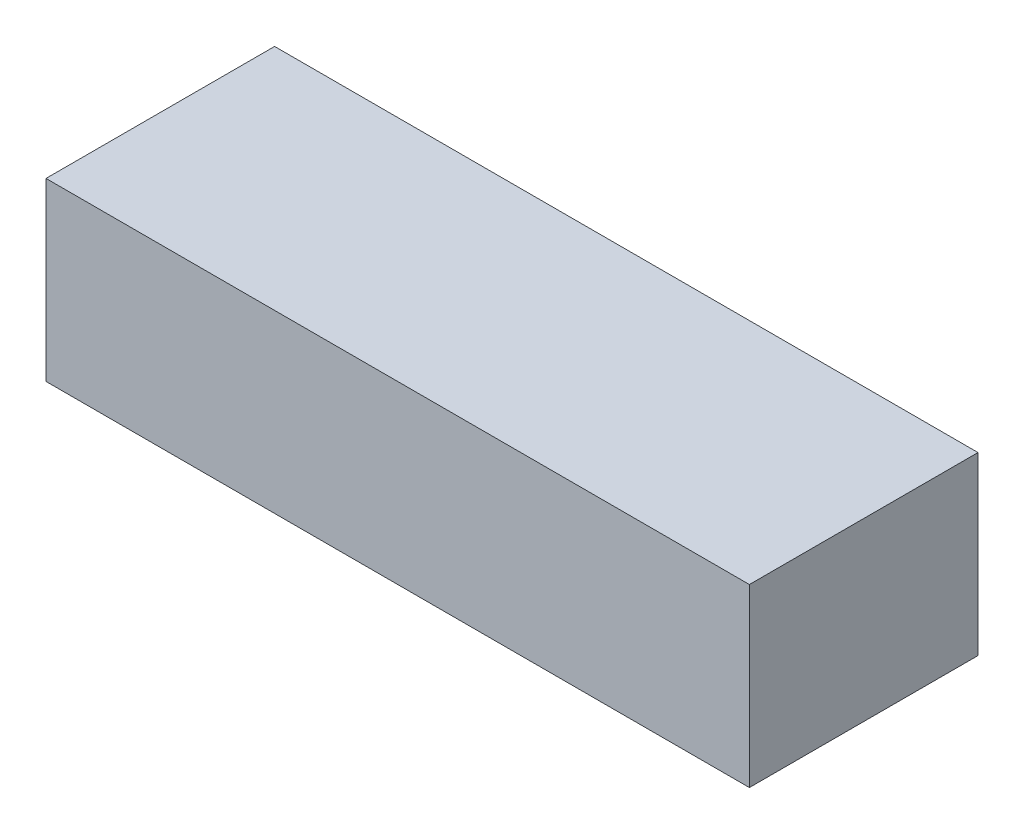
ISO-10303-21;
HEADER;
FILE_DESCRIPTION(('STEP AP214'),'2;1');
FILE_NAME('part.step','',(''),(''),'','','');
FILE_SCHEMA(('AUTOMOTIVE_DESIGN { 1 0 10303 214 1 1 1 1 }'));
ENDSEC;
DATA;
#1=APPLICATION_CONTEXT('core data for automotive mechanical design processes');
#2=APPLICATION_PROTOCOL_DEFINITION('international standard','automotive_design',2000,#1);
#3=PRODUCT_CONTEXT('',#1,'mechanical');
#4=PRODUCT('Part','Part','',(#3));
#5=PRODUCT_RELATED_PRODUCT_CATEGORY('part','',(#4));
#6=PRODUCT_DEFINITION_FORMATION('','',#4);
#7=PRODUCT_DEFINITION_CONTEXT('part definition',#1,'design');
#8=PRODUCT_DEFINITION('design','',#6,#7);
#9=PRODUCT_DEFINITION_SHAPE('','',#8);
#10=(LENGTH_UNIT() NAMED_UNIT(*) SI_UNIT(.MILLI.,.METRE.));
#11=(NAMED_UNIT(*) PLANE_ANGLE_UNIT() SI_UNIT($,.RADIAN.));
#12=(NAMED_UNIT(*) SI_UNIT($,.STERADIAN.) SOLID_ANGLE_UNIT());
#13=UNCERTAINTY_MEASURE_WITH_UNIT(LENGTH_MEASURE(1.E-05),#10,'distance_accuracy_value','');
#14=(GEOMETRIC_REPRESENTATION_CONTEXT(3) GLOBAL_UNCERTAINTY_ASSIGNED_CONTEXT((#13)) GLOBAL_UNIT_ASSIGNED_CONTEXT((#10,
#11,#12)) REPRESENTATION_CONTEXT('',''));
#15=CARTESIAN_POINT('',(0.,0.,0.));
#16=DIRECTION('',(0.,0.,1.));
#17=DIRECTION('',(1.,0.,0.));
#18=AXIS2_PLACEMENT_3D('',#15,#16,#17);
#19=CARTESIAN_POINT('',(0.,-10.,0.));
#20=DIRECTION('',(-1.,0.,0.));
#21=DIRECTION('',(0.,0.,1.));
#22=AXIS2_PLACEMENT_3D('',#19,#20,#21);
#23=PLANE('',#22);
#24=DIRECTION('',(0.,0.,1.));
#25=VECTOR('',#24,1.);
#26=CARTESIAN_POINT('',(0.,0.,0.));
#27=LINE('',#26,#25);
#28=CARTESIAN_POINT('',(0.,0.,-13.));
#29=VERTEX_POINT('',#28);
#30=CARTESIAN_POINT('',(0.,0.,0.));
#31=VERTEX_POINT('',#30);
#32=EDGE_CURVE('E104',#29,#31,#27,.T.);
#33=ORIENTED_EDGE('',*,*,#32,.F.);
#34=DIRECTION('',(0.,1.,0.));
#35=VECTOR('',#34,1.);
#36=CARTESIAN_POINT('',(0.,-10.,-13.));
#37=LINE('',#36,#35);
#38=CARTESIAN_POINT('',(0.,-10.,-13.));
#39=VERTEX_POINT('',#38);
#40=EDGE_CURVE('E11',#39,#29,#37,.T.);
#41=ORIENTED_EDGE('',*,*,#40,.F.);
#42=DIRECTION('',(0.,0.,1.));
#43=VECTOR('',#42,1.);
#44=CARTESIAN_POINT('',(0.,-10.,0.));
#45=LINE('',#44,#43);
#46=CARTESIAN_POINT('',(0.,-10.,0.));
#47=VERTEX_POINT('',#46);
#48=EDGE_CURVE('E100',#39,#47,#45,.T.);
#49=ORIENTED_EDGE('',*,*,#48,.T.);
#50=DIRECTION('',(0.,1.,0.));
#51=VECTOR('',#50,1.);
#52=CARTESIAN_POINT('',(0.,-10.,0.));
#53=LINE('',#52,#51);
#54=EDGE_CURVE('E45',#47,#31,#53,.T.);
#55=ORIENTED_EDGE('',*,*,#54,.T.);
#56=EDGE_LOOP('',(#33,#41,#49,#55));
#57=FACE_BOUND('',#56,.T.);
#58=ADVANCED_FACE('F39',(#57),#23,.T.);
#59=CARTESIAN_POINT('',(0.,-10.,-13.));
#60=DIRECTION('',(0.,0.,-1.));
#61=DIRECTION('',(-1.,0.,0.));
#62=AXIS2_PLACEMENT_3D('',#59,#60,#61);
#63=PLANE('',#62);
#64=DIRECTION('',(-1.,0.,0.));
#65=VECTOR('',#64,1.);
#66=CARTESIAN_POINT('',(0.,0.,-13.));
#67=LINE('',#66,#65);
#68=CARTESIAN_POINT('',(40.,0.,-13.));
#69=VERTEX_POINT('',#68);
#70=EDGE_CURVE('E98',#69,#29,#67,.T.);
#71=ORIENTED_EDGE('',*,*,#70,.F.);
#72=DIRECTION('',(0.,1.,0.));
#73=VECTOR('',#72,1.);
#74=CARTESIAN_POINT('',(40.,-10.,-13.));
#75=LINE('',#74,#73);
#76=CARTESIAN_POINT('',(40.,-10.,-13.));
#77=VERTEX_POINT('',#76);
#78=EDGE_CURVE('E48',#77,#69,#75,.T.);
#79=ORIENTED_EDGE('',*,*,#78,.F.);
#80=DIRECTION('',(-1.,0.,0.));
#81=VECTOR('',#80,1.);
#82=CARTESIAN_POINT('',(0.,-10.,-13.));
#83=LINE('',#82,#81);
#84=EDGE_CURVE('E92',#77,#39,#83,.T.);
#85=ORIENTED_EDGE('',*,*,#84,.T.);
#86=ORIENTED_EDGE('',*,*,#40,.T.);
#87=EDGE_LOOP('',(#71,#79,#85,#86));
#88=FACE_BOUND('',#87,.T.);
#89=ADVANCED_FACE('F111',(#88),#63,.T.);
#90=CARTESIAN_POINT('',(40.,-10.,0.));
#91=DIRECTION('',(1.,0.,0.));
#92=DIRECTION('',(0.,0.,-1.));
#93=AXIS2_PLACEMENT_3D('',#90,#91,#92);
#94=PLANE('',#93);
#95=DIRECTION('',(0.,0.,-1.));
#96=VECTOR('',#95,1.);
#97=CARTESIAN_POINT('',(40.,0.,0.));
#98=LINE('',#97,#96);
#99=CARTESIAN_POINT('',(40.,0.,0.));
#100=VERTEX_POINT('',#99);
#101=EDGE_CURVE('E87',#100,#69,#98,.T.);
#102=ORIENTED_EDGE('',*,*,#101,.F.);
#103=DIRECTION('',(0.,1.,0.));
#104=VECTOR('',#103,1.);
#105=CARTESIAN_POINT('',(40.,-10.,0.));
#106=LINE('',#105,#104);
#107=CARTESIAN_POINT('',(40.,-10.,0.));
#108=VERTEX_POINT('',#107);
#109=EDGE_CURVE('E84',#108,#100,#106,.T.);
#110=ORIENTED_EDGE('',*,*,#109,.F.);
#111=DIRECTION('',(0.,0.,-1.));
#112=VECTOR('',#111,1.);
#113=CARTESIAN_POINT('',(40.,-10.,0.));
#114=LINE('',#113,#112);
#115=EDGE_CURVE('E90',#108,#77,#114,.T.);
#116=ORIENTED_EDGE('',*,*,#115,.T.);
#117=ORIENTED_EDGE('',*,*,#78,.T.);
#118=EDGE_LOOP('',(#102,#110,#116,#117));
#119=FACE_BOUND('',#118,.T.);
#120=ADVANCED_FACE('F86',(#119),#94,.T.);
#121=CARTESIAN_POINT('',(0.,-10.,0.));
#122=DIRECTION('',(0.,0.,1.));
#123=DIRECTION('',(1.,0.,0.));
#124=AXIS2_PLACEMENT_3D('',#121,#122,#123);
#125=PLANE('',#124);
#126=DIRECTION('',(1.,0.,0.));
#127=VECTOR('',#126,1.);
#128=CARTESIAN_POINT('',(0.,0.,0.));
#129=LINE('',#128,#127);
#130=EDGE_CURVE('E106',#31,#100,#129,.T.);
#131=ORIENTED_EDGE('',*,*,#130,.F.);
#132=ORIENTED_EDGE('',*,*,#54,.F.);
#133=DIRECTION('',(1.,0.,0.));
#134=VECTOR('',#133,1.);
#135=CARTESIAN_POINT('',(0.,-10.,0.));
#136=LINE('',#135,#134);
#137=EDGE_CURVE('E93',#47,#108,#136,.T.);
#138=ORIENTED_EDGE('',*,*,#137,.T.);
#139=ORIENTED_EDGE('',*,*,#109,.T.);
#140=EDGE_LOOP('',(#131,#132,#138,#139));
#141=FACE_BOUND('',#140,.T.);
#142=ADVANCED_FACE('F96',(#141),#125,.T.);
#143=CARTESIAN_POINT('',(0.,-10.,0.));
#144=DIRECTION('',(0.,-1.,0.));
#145=DIRECTION('',(0.,0.,-1.));
#146=AXIS2_PLACEMENT_3D('',#143,#144,#145);
#147=PLANE('',#146);
#148=ORIENTED_EDGE('',*,*,#48,.F.);
#149=ORIENTED_EDGE('',*,*,#84,.F.);
#150=ORIENTED_EDGE('',*,*,#115,.F.);
#151=ORIENTED_EDGE('',*,*,#137,.F.);
#152=EDGE_LOOP('',(#148,#149,#150,#151));
#153=FACE_BOUND('',#152,.T.);
#154=ADVANCED_FACE('F95',(#153),#147,.T.);
#155=CARTESIAN_POINT('',(0.,0.,0.));
#156=DIRECTION('',(0.,-1.,0.));
#157=DIRECTION('',(0.,0.,-1.));
#158=AXIS2_PLACEMENT_3D('',#155,#156,#157);
#159=PLANE('',#158);
#160=ORIENTED_EDGE('',*,*,#32,.T.);
#161=ORIENTED_EDGE('',*,*,#130,.T.);
#162=ORIENTED_EDGE('',*,*,#101,.T.);
#163=ORIENTED_EDGE('',*,*,#70,.T.);
#164=EDGE_LOOP('',(#160,#161,#162,#163));
#165=FACE_BOUND('',#164,.T.);
#166=ADVANCED_FACE('F115',(#165),#159,.F.);
#167=CLOSED_SHELL('',(#58,#89,#120,#142,#154,#166));
#168=MANIFOLD_SOLID_BREP('B2',#167);
#169=ADVANCED_BREP_SHAPE_REPRESENTATION('',(#18,#168),#14);
#170=SHAPE_DEFINITION_REPRESENTATION(#9,#169);
ENDSEC;
END-ISO-10303-21;
